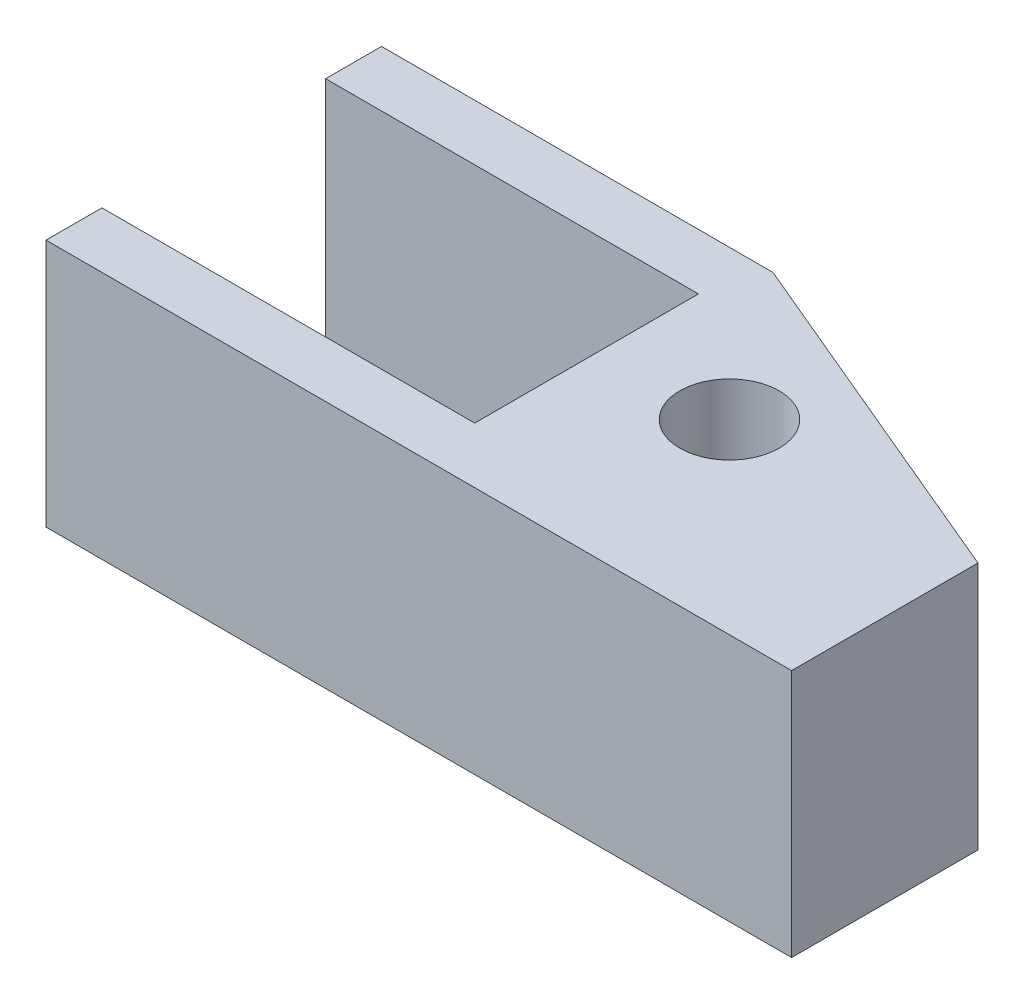
ISO-10303-21;
HEADER;
FILE_DESCRIPTION(('STEP AP214'),'2;1');
FILE_NAME('part.step','',(''),(''),'','','');
FILE_SCHEMA(('AUTOMOTIVE_DESIGN { 1 0 10303 214 1 1 1 1 }'));
ENDSEC;
DATA;
#1=APPLICATION_CONTEXT('core data for automotive mechanical design processes');
#2=APPLICATION_PROTOCOL_DEFINITION('international standard','automotive_design',2000,#1);
#3=PRODUCT_CONTEXT('',#1,'mechanical');
#4=PRODUCT('Part','Part','',(#3));
#5=PRODUCT_RELATED_PRODUCT_CATEGORY('part','',(#4));
#6=PRODUCT_DEFINITION_FORMATION('','',#4);
#7=PRODUCT_DEFINITION_CONTEXT('part definition',#1,'design');
#8=PRODUCT_DEFINITION('design','',#6,#7);
#9=PRODUCT_DEFINITION_SHAPE('','',#8);
#10=(LENGTH_UNIT() NAMED_UNIT(*) SI_UNIT(.MILLI.,.METRE.));
#11=(NAMED_UNIT(*) PLANE_ANGLE_UNIT() SI_UNIT($,.RADIAN.));
#12=(NAMED_UNIT(*) SI_UNIT($,.STERADIAN.) SOLID_ANGLE_UNIT());
#13=UNCERTAINTY_MEASURE_WITH_UNIT(LENGTH_MEASURE(1.E-05),#10,'distance_accuracy_value','');
#14=(GEOMETRIC_REPRESENTATION_CONTEXT(3) GLOBAL_UNCERTAINTY_ASSIGNED_CONTEXT((#13)) GLOBAL_UNIT_ASSIGNED_CONTEXT((#10,
#11,#12)) REPRESENTATION_CONTEXT('',''));
#15=CARTESIAN_POINT('',(0.,0.,0.));
#16=DIRECTION('',(0.,0.,1.));
#17=DIRECTION('',(1.,0.,0.));
#18=AXIS2_PLACEMENT_3D('',#15,#16,#17);
#19=CARTESIAN_POINT('',(0.,20.,0.));
#20=DIRECTION('',(0.,1.,0.));
#21=DIRECTION('',(0.,0.,1.));
#22=AXIS2_PLACEMENT_3D('',#19,#20,#21);
#23=PLANE('',#22);
#24=DIRECTION('',(0.,0.,-1.));
#25=VECTOR('',#24,1.);
#26=CARTESIAN_POINT('',(30.,20.,-1.5));
#27=LINE('',#26,#25);
#28=CARTESIAN_POINT('',(30.,20.,13.5));
#29=VERTEX_POINT('',#28);
#30=CARTESIAN_POINT('',(30.,20.,-1.5));
#31=VERTEX_POINT('',#30);
#32=EDGE_CURVE('E157',#29,#31,#27,.T.);
#33=ORIENTED_EDGE('',*,*,#32,.T.);
#34=DIRECTION('',(-0.921635375138065,0.,-0.388057000058133));
#35=VECTOR('',#34,1.);
#36=CARTESIAN_POINT('',(1.5,20.,-13.5));
#37=LINE('',#36,#35);
#38=CARTESIAN_POINT('',(1.5,20.,-13.5));
#39=VERTEX_POINT('',#38);
#40=EDGE_CURVE('E100',#31,#39,#37,.T.);
#41=ORIENTED_EDGE('',*,*,#40,.T.);
#42=DIRECTION('',(-1.,0.,0.));
#43=VECTOR('',#42,1.);
#44=CARTESIAN_POINT('',(-30.,20.,-13.5));
#45=LINE('',#44,#43);
#46=CARTESIAN_POINT('',(-30.,20.,-13.5));
#47=VERTEX_POINT('',#46);
#48=EDGE_CURVE('E175',#39,#47,#45,.T.);
#49=ORIENTED_EDGE('',*,*,#48,.T.);
#50=DIRECTION('',(0.,0.,1.));
#51=VECTOR('',#50,1.);
#52=CARTESIAN_POINT('',(-30.,20.,-13.5));
#53=LINE('',#52,#51);
#54=CARTESIAN_POINT('',(-30.,20.,-8.99999999999999));
#55=VERTEX_POINT('',#54);
#56=EDGE_CURVE('E192',#47,#55,#53,.T.);
#57=ORIENTED_EDGE('',*,*,#56,.T.);
#58=DIRECTION('',(1.,0.,0.));
#59=VECTOR('',#58,1.);
#60=CARTESIAN_POINT('',(0.,20.,-9.));
#61=LINE('',#60,#59);
#62=CARTESIAN_POINT('',(0.,20.,-9.));
#63=VERTEX_POINT('',#62);
#64=EDGE_CURVE('E191',#55,#63,#61,.T.);
#65=ORIENTED_EDGE('',*,*,#64,.T.);
#66=DIRECTION('',(0.,0.,1.));
#67=VECTOR('',#66,1.);
#68=CARTESIAN_POINT('',(0.,20.,9.));
#69=LINE('',#68,#67);
#70=CARTESIAN_POINT('',(0.,20.,9.));
#71=VERTEX_POINT('',#70);
#72=EDGE_CURVE('E122',#63,#71,#69,.T.);
#73=ORIENTED_EDGE('',*,*,#72,.T.);
#74=DIRECTION('',(-1.,0.,0.));
#75=VECTOR('',#74,1.);
#76=CARTESIAN_POINT('',(0.,20.,9.));
#77=LINE('',#76,#75);
#78=CARTESIAN_POINT('',(-30.,20.,9.));
#79=VERTEX_POINT('',#78);
#80=EDGE_CURVE('E116',#71,#79,#77,.T.);
#81=ORIENTED_EDGE('',*,*,#80,.T.);
#82=DIRECTION('',(0.,0.,1.));
#83=VECTOR('',#82,1.);
#84=CARTESIAN_POINT('',(-30.,20.,9.));
#85=LINE('',#84,#83);
#86=CARTESIAN_POINT('',(-30.,20.,13.5));
#87=VERTEX_POINT('',#86);
#88=EDGE_CURVE('E120',#79,#87,#85,.T.);
#89=ORIENTED_EDGE('',*,*,#88,.T.);
#90=DIRECTION('',(1.,0.,0.));
#91=VECTOR('',#90,1.);
#92=CARTESIAN_POINT('',(-30.,20.,13.5));
#93=LINE('',#92,#91);
#94=EDGE_CURVE('E54',#87,#29,#93,.T.);
#95=ORIENTED_EDGE('',*,*,#94,.T.);
#96=EDGE_LOOP('',(#33,#41,#49,#57,#65,#73,#81,#89,#95));
#97=FACE_BOUND('',#96,.T.);
#98=CARTESIAN_POINT('',(10.,20.,-1.5));
#99=DIRECTION('',(0.,1.,0.));
#100=DIRECTION('',(0.,0.,1.));
#101=AXIS2_PLACEMENT_3D('',#98,#99,#100);
#102=CIRCLE('',#101,4.);
#103=CARTESIAN_POINT('',(10.,20.,2.5));
#104=VERTEX_POINT('',#103);
#105=EDGE_CURVE('E144',#104,#104,#102,.T.);
#106=ORIENTED_EDGE('',*,*,#105,.F.);
#107=EDGE_LOOP('',(#106));
#108=FACE_BOUND('',#107,.T.);
#109=ADVANCED_FACE('F37',(#97,#108),#23,.T.);
#110=CARTESIAN_POINT('',(0.,0.,0.));
#111=DIRECTION('',(0.,1.,0.));
#112=DIRECTION('',(0.,0.,1.));
#113=AXIS2_PLACEMENT_3D('',#110,#111,#112);
#114=PLANE('',#113);
#115=DIRECTION('',(0.,0.,-1.));
#116=VECTOR('',#115,1.);
#117=CARTESIAN_POINT('',(30.,0.,-1.5));
#118=LINE('',#117,#116);
#119=CARTESIAN_POINT('',(30.,0.,13.5));
#120=VERTEX_POINT('',#119);
#121=CARTESIAN_POINT('',(30.,0.,-1.5));
#122=VERTEX_POINT('',#121);
#123=EDGE_CURVE('E140',#120,#122,#118,.T.);
#124=ORIENTED_EDGE('',*,*,#123,.F.);
#125=DIRECTION('',(1.,0.,0.));
#126=VECTOR('',#125,1.);
#127=CARTESIAN_POINT('',(-30.,0.,13.5));
#128=LINE('',#127,#126);
#129=CARTESIAN_POINT('',(-30.,0.,13.5));
#130=VERTEX_POINT('',#129);
#131=EDGE_CURVE('E92',#130,#120,#128,.T.);
#132=ORIENTED_EDGE('',*,*,#131,.F.);
#133=DIRECTION('',(0.,0.,1.));
#134=VECTOR('',#133,1.);
#135=CARTESIAN_POINT('',(-30.,0.,9.));
#136=LINE('',#135,#134);
#137=CARTESIAN_POINT('',(-30.,0.,9.));
#138=VERTEX_POINT('',#137);
#139=EDGE_CURVE('E86',#138,#130,#136,.T.);
#140=ORIENTED_EDGE('',*,*,#139,.F.);
#141=DIRECTION('',(-1.,0.,0.));
#142=VECTOR('',#141,1.);
#143=CARTESIAN_POINT('',(0.,0.,9.));
#144=LINE('',#143,#142);
#145=CARTESIAN_POINT('',(0.,0.,9.));
#146=VERTEX_POINT('',#145);
#147=EDGE_CURVE('E130',#146,#138,#144,.T.);
#148=ORIENTED_EDGE('',*,*,#147,.F.);
#149=DIRECTION('',(0.,0.,1.));
#150=VECTOR('',#149,1.);
#151=CARTESIAN_POINT('',(0.,0.,9.));
#152=LINE('',#151,#150);
#153=CARTESIAN_POINT('',(0.,0.,-9.));
#154=VERTEX_POINT('',#153);
#155=EDGE_CURVE('E152',#154,#146,#152,.T.);
#156=ORIENTED_EDGE('',*,*,#155,.F.);
#157=DIRECTION('',(1.,0.,0.));
#158=VECTOR('',#157,1.);
#159=CARTESIAN_POINT('',(0.,0.,-9.));
#160=LINE('',#159,#158);
#161=CARTESIAN_POINT('',(-30.,0.,-8.99999999999999));
#162=VERTEX_POINT('',#161);
#163=EDGE_CURVE('E150',#162,#154,#160,.T.);
#164=ORIENTED_EDGE('',*,*,#163,.F.);
#165=DIRECTION('',(0.,0.,1.));
#166=VECTOR('',#165,1.);
#167=CARTESIAN_POINT('',(-30.,0.,-13.5));
#168=LINE('',#167,#166);
#169=CARTESIAN_POINT('',(-30.,0.,-13.5));
#170=VERTEX_POINT('',#169);
#171=EDGE_CURVE('E148',#170,#162,#168,.T.);
#172=ORIENTED_EDGE('',*,*,#171,.F.);
#173=DIRECTION('',(-1.,0.,0.));
#174=VECTOR('',#173,1.);
#175=CARTESIAN_POINT('',(-30.,0.,-13.5));
#176=LINE('',#175,#174);
#177=CARTESIAN_POINT('',(1.5,0.,-13.5));
#178=VERTEX_POINT('',#177);
#179=EDGE_CURVE('E146',#178,#170,#176,.T.);
#180=ORIENTED_EDGE('',*,*,#179,.F.);
#181=DIRECTION('',(-0.921635375138065,0.,-0.388057000058133));
#182=VECTOR('',#181,1.);
#183=CARTESIAN_POINT('',(1.5,0.,-13.5));
#184=LINE('',#183,#182);
#185=EDGE_CURVE('E143',#122,#178,#184,.T.);
#186=ORIENTED_EDGE('',*,*,#185,.F.);
#187=EDGE_LOOP('',(#124,#132,#140,#148,#156,#164,#172,#180,#186));
#188=FACE_BOUND('',#187,.T.);
#189=CARTESIAN_POINT('',(10.,0.,-1.5));
#190=DIRECTION('',(0.,1.,0.));
#191=DIRECTION('',(0.,0.,1.));
#192=AXIS2_PLACEMENT_3D('',#189,#190,#191);
#193=CIRCLE('',#192,4.);
#194=CARTESIAN_POINT('',(10.,0.,2.5));
#195=VERTEX_POINT('',#194);
#196=EDGE_CURVE('E199',#195,#195,#193,.T.);
#197=ORIENTED_EDGE('',*,*,#196,.T.);
#198=EDGE_LOOP('',(#197));
#199=FACE_BOUND('',#198,.T.);
#200=ADVANCED_FACE('F179',(#188,#199),#114,.F.);
#201=CARTESIAN_POINT('',(30.,20.,-1.5));
#202=DIRECTION('',(-1.,0.,0.));
#203=DIRECTION('',(0.,0.,1.));
#204=AXIS2_PLACEMENT_3D('',#201,#202,#203);
#205=PLANE('',#204);
#206=ORIENTED_EDGE('',*,*,#123,.T.);
#207=DIRECTION('',(0.,-1.,0.));
#208=VECTOR('',#207,1.);
#209=CARTESIAN_POINT('',(30.,20.,-1.5));
#210=LINE('',#209,#208);
#211=EDGE_CURVE('E11',#31,#122,#210,.T.);
#212=ORIENTED_EDGE('',*,*,#211,.F.);
#213=ORIENTED_EDGE('',*,*,#32,.F.);
#214=DIRECTION('',(0.,-1.,0.));
#215=VECTOR('',#214,1.);
#216=CARTESIAN_POINT('',(30.,20.,13.5));
#217=LINE('',#216,#215);
#218=EDGE_CURVE('E136',#29,#120,#217,.T.);
#219=ORIENTED_EDGE('',*,*,#218,.T.);
#220=EDGE_LOOP('',(#206,#212,#213,#219));
#221=FACE_BOUND('',#220,.T.);
#222=ADVANCED_FACE('F39',(#221),#205,.F.);
#223=CARTESIAN_POINT('',(1.5,20.,-13.5));
#224=DIRECTION('',(-0.388057000058133,0.,0.921635375138065));
#225=DIRECTION('',(0.921635375138065,0.,0.388057000058133));
#226=AXIS2_PLACEMENT_3D('',#223,#224,#225);
#227=PLANE('',#226);
#228=ORIENTED_EDGE('',*,*,#185,.T.);
#229=DIRECTION('',(0.,-1.,0.));
#230=VECTOR('',#229,1.);
#231=CARTESIAN_POINT('',(1.5,20.,-13.5));
#232=LINE('',#231,#230);
#233=EDGE_CURVE('E46',#39,#178,#232,.T.);
#234=ORIENTED_EDGE('',*,*,#233,.F.);
#235=ORIENTED_EDGE('',*,*,#40,.F.);
#236=ORIENTED_EDGE('',*,*,#211,.T.);
#237=EDGE_LOOP('',(#228,#234,#235,#236));
#238=FACE_BOUND('',#237,.T.);
#239=ADVANCED_FACE('F231',(#238),#227,.F.);
#240=CARTESIAN_POINT('',(-30.,20.,-13.5));
#241=DIRECTION('',(0.,0.,1.));
#242=DIRECTION('',(1.,0.,0.));
#243=AXIS2_PLACEMENT_3D('',#240,#241,#242);
#244=PLANE('',#243);
#245=ORIENTED_EDGE('',*,*,#179,.T.);
#246=DIRECTION('',(0.,-1.,0.));
#247=VECTOR('',#246,1.);
#248=CARTESIAN_POINT('',(-30.,20.,-13.5));
#249=LINE('',#248,#247);
#250=EDGE_CURVE('E167',#47,#170,#249,.T.);
#251=ORIENTED_EDGE('',*,*,#250,.F.);
#252=ORIENTED_EDGE('',*,*,#48,.F.);
#253=ORIENTED_EDGE('',*,*,#233,.T.);
#254=EDGE_LOOP('',(#245,#251,#252,#253));
#255=FACE_BOUND('',#254,.T.);
#256=ADVANCED_FACE('F173',(#255),#244,.F.);
#257=CARTESIAN_POINT('',(-30.,20.,-13.5));
#258=DIRECTION('',(1.,0.,0.));
#259=DIRECTION('',(0.,0.,-1.));
#260=AXIS2_PLACEMENT_3D('',#257,#258,#259);
#261=PLANE('',#260);
#262=ORIENTED_EDGE('',*,*,#171,.T.);
#263=DIRECTION('',(0.,-1.,0.));
#264=VECTOR('',#263,1.);
#265=CARTESIAN_POINT('',(-30.,20.,-8.99999999999999));
#266=LINE('',#265,#264);
#267=EDGE_CURVE('E164',#55,#162,#266,.T.);
#268=ORIENTED_EDGE('',*,*,#267,.F.);
#269=ORIENTED_EDGE('',*,*,#56,.F.);
#270=ORIENTED_EDGE('',*,*,#250,.T.);
#271=EDGE_LOOP('',(#262,#268,#269,#270));
#272=FACE_BOUND('',#271,.T.);
#273=ADVANCED_FACE('F185',(#272),#261,.F.);
#274=CARTESIAN_POINT('',(0.,20.,-9.));
#275=DIRECTION('',(0.,0.,-1.));
#276=DIRECTION('',(-1.,0.,0.));
#277=AXIS2_PLACEMENT_3D('',#274,#275,#276);
#278=PLANE('',#277);
#279=ORIENTED_EDGE('',*,*,#163,.T.);
#280=DIRECTION('',(0.,-1.,0.));
#281=VECTOR('',#280,1.);
#282=CARTESIAN_POINT('',(0.,20.,-9.));
#283=LINE('',#282,#281);
#284=EDGE_CURVE('E161',#63,#154,#283,.T.);
#285=ORIENTED_EDGE('',*,*,#284,.F.);
#286=ORIENTED_EDGE('',*,*,#64,.F.);
#287=ORIENTED_EDGE('',*,*,#267,.T.);
#288=EDGE_LOOP('',(#279,#285,#286,#287));
#289=FACE_BOUND('',#288,.T.);
#290=ADVANCED_FACE('F189',(#289),#278,.F.);
#291=CARTESIAN_POINT('',(0.,20.,9.));
#292=DIRECTION('',(1.,0.,0.));
#293=DIRECTION('',(0.,0.,-1.));
#294=AXIS2_PLACEMENT_3D('',#291,#292,#293);
#295=PLANE('',#294);
#296=ORIENTED_EDGE('',*,*,#155,.T.);
#297=DIRECTION('',(0.,-1.,0.));
#298=VECTOR('',#297,1.);
#299=CARTESIAN_POINT('',(0.,20.,9.));
#300=LINE('',#299,#298);
#301=EDGE_CURVE('E131',#71,#146,#300,.T.);
#302=ORIENTED_EDGE('',*,*,#301,.F.);
#303=ORIENTED_EDGE('',*,*,#72,.F.);
#304=ORIENTED_EDGE('',*,*,#284,.T.);
#305=EDGE_LOOP('',(#296,#302,#303,#304));
#306=FACE_BOUND('',#305,.T.);
#307=ADVANCED_FACE('F222',(#306),#295,.F.);
#308=CARTESIAN_POINT('',(0.,20.,9.));
#309=DIRECTION('',(0.,0.,1.));
#310=DIRECTION('',(1.,0.,0.));
#311=AXIS2_PLACEMENT_3D('',#308,#309,#310);
#312=PLANE('',#311);
#313=ORIENTED_EDGE('',*,*,#147,.T.);
#314=DIRECTION('',(0.,-1.,0.));
#315=VECTOR('',#314,1.);
#316=CARTESIAN_POINT('',(-30.,20.,9.));
#317=LINE('',#316,#315);
#318=EDGE_CURVE('E127',#79,#138,#317,.T.);
#319=ORIENTED_EDGE('',*,*,#318,.F.);
#320=ORIENTED_EDGE('',*,*,#80,.F.);
#321=ORIENTED_EDGE('',*,*,#301,.T.);
#322=EDGE_LOOP('',(#313,#319,#320,#321));
#323=FACE_BOUND('',#322,.T.);
#324=ADVANCED_FACE('F128',(#323),#312,.F.);
#325=CARTESIAN_POINT('',(-30.,20.,9.));
#326=DIRECTION('',(1.,0.,0.));
#327=DIRECTION('',(0.,0.,-1.));
#328=AXIS2_PLACEMENT_3D('',#325,#326,#327);
#329=PLANE('',#328);
#330=ORIENTED_EDGE('',*,*,#139,.T.);
#331=DIRECTION('',(0.,-1.,0.));
#332=VECTOR('',#331,1.);
#333=CARTESIAN_POINT('',(-30.,20.,13.5));
#334=LINE('',#333,#332);
#335=EDGE_CURVE('E132',#87,#130,#334,.T.);
#336=ORIENTED_EDGE('',*,*,#335,.F.);
#337=ORIENTED_EDGE('',*,*,#88,.F.);
#338=ORIENTED_EDGE('',*,*,#318,.T.);
#339=EDGE_LOOP('',(#330,#336,#337,#338));
#340=FACE_BOUND('',#339,.T.);
#341=ADVANCED_FACE('F134',(#340),#329,.F.);
#342=CARTESIAN_POINT('',(-30.,20.,13.5));
#343=DIRECTION('',(0.,0.,-1.));
#344=DIRECTION('',(-1.,0.,0.));
#345=AXIS2_PLACEMENT_3D('',#342,#343,#344);
#346=PLANE('',#345);
#347=ORIENTED_EDGE('',*,*,#131,.T.);
#348=ORIENTED_EDGE('',*,*,#218,.F.);
#349=ORIENTED_EDGE('',*,*,#94,.F.);
#350=ORIENTED_EDGE('',*,*,#335,.T.);
#351=EDGE_LOOP('',(#347,#348,#349,#350));
#352=FACE_BOUND('',#351,.T.);
#353=ADVANCED_FACE('F215',(#352),#346,.F.);
#354=CARTESIAN_POINT('',(10.,20.,-1.5));
#355=DIRECTION('',(0.,-1.,0.));
#356=DIRECTION('',(0.,0.,-1.));
#357=AXIS2_PLACEMENT_3D('',#354,#355,#356);
#358=CYLINDRICAL_SURFACE('',#357,4.);
#359=ORIENTED_EDGE('',*,*,#105,.T.);
#360=EDGE_LOOP('',(#359));
#361=FACE_BOUND('',#360,.T.);
#362=ORIENTED_EDGE('',*,*,#196,.F.);
#363=EDGE_LOOP('',(#362));
#364=FACE_BOUND('',#363,.T.);
#365=ADVANCED_FACE('F205',(#361,#364),#358,.F.);
#366=CLOSED_SHELL('',(#109,#200,#222,#239,#256,#273,#290,#307,#324,#341,#353,#365));
#367=MANIFOLD_SOLID_BREP('B2',#366);
#368=ADVANCED_BREP_SHAPE_REPRESENTATION('',(#18,#367),#14);
#369=SHAPE_DEFINITION_REPRESENTATION(#9,#368);
ENDSEC;
END-ISO-10303-21;
